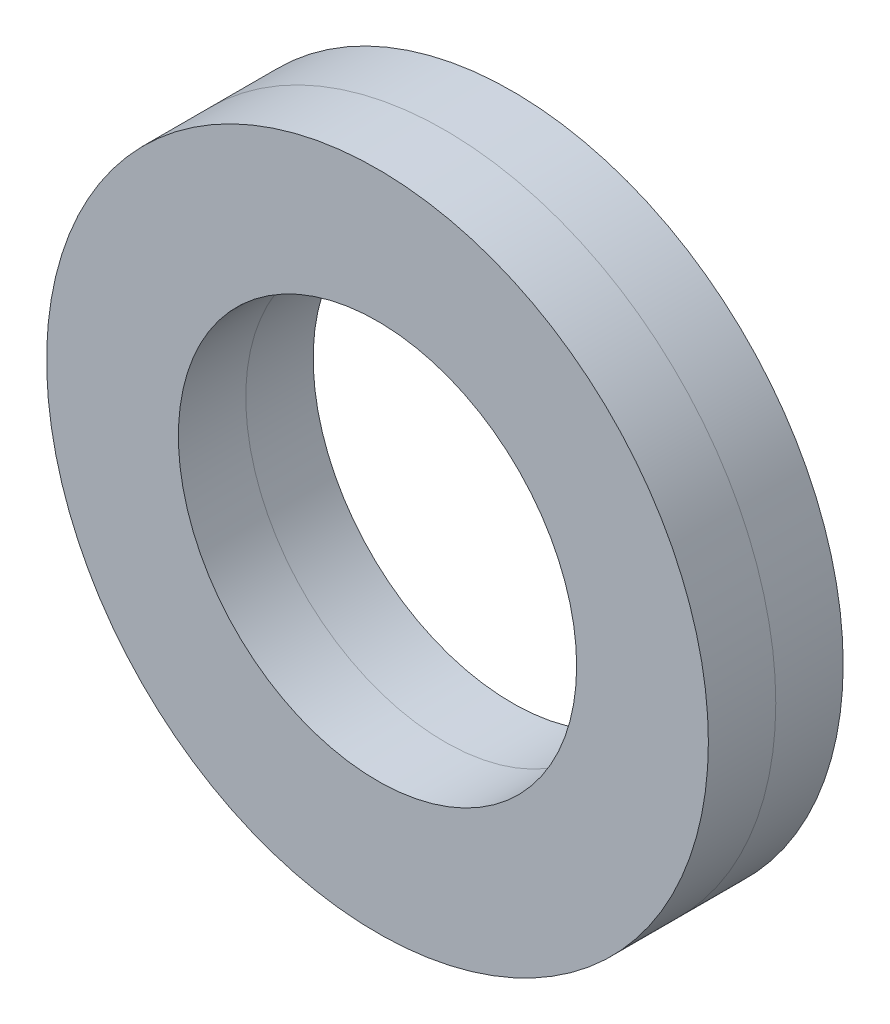
ISO-10303-21;
HEADER;
FILE_DESCRIPTION(('STEP AP214'),'2;1');
FILE_NAME('part.step','',(''),(''),'','','');
FILE_SCHEMA(('AUTOMOTIVE_DESIGN { 1 0 10303 214 1 1 1 1 }'));
ENDSEC;
DATA;
#1=APPLICATION_CONTEXT('core data for automotive mechanical design processes');
#2=APPLICATION_PROTOCOL_DEFINITION('international standard','automotive_design',2000,#1);
#3=PRODUCT_CONTEXT('',#1,'mechanical');
#4=PRODUCT('Part','Part','',(#3));
#5=PRODUCT_RELATED_PRODUCT_CATEGORY('part','',(#4));
#6=PRODUCT_DEFINITION_FORMATION('','',#4);
#7=PRODUCT_DEFINITION_CONTEXT('part definition',#1,'design');
#8=PRODUCT_DEFINITION('design','',#6,#7);
#9=PRODUCT_DEFINITION_SHAPE('','',#8);
#10=(LENGTH_UNIT() NAMED_UNIT(*) SI_UNIT(.MILLI.,.METRE.));
#11=(NAMED_UNIT(*) PLANE_ANGLE_UNIT() SI_UNIT($,.RADIAN.));
#12=(NAMED_UNIT(*) SI_UNIT($,.STERADIAN.) SOLID_ANGLE_UNIT());
#13=UNCERTAINTY_MEASURE_WITH_UNIT(LENGTH_MEASURE(1.E-05),#10,'distance_accuracy_value','');
#14=(GEOMETRIC_REPRESENTATION_CONTEXT(3) GLOBAL_UNCERTAINTY_ASSIGNED_CONTEXT((#13)) GLOBAL_UNIT_ASSIGNED_CONTEXT((#10,
#11,#12)) REPRESENTATION_CONTEXT('',''));
#15=CARTESIAN_POINT('',(0.,0.,0.));
#16=DIRECTION('',(0.,0.,1.));
#17=DIRECTION('',(1.,0.,0.));
#18=AXIS2_PLACEMENT_3D('',#15,#16,#17);
#19=CARTESIAN_POINT('',(0.,0.,0.));
#20=DIRECTION('',(0.,0.,1.));
#21=DIRECTION('',(1.,0.,0.));
#22=AXIS2_PLACEMENT_3D('',#19,#20,#21);
#23=CYLINDRICAL_SURFACE('',#22,3.25);
#24=CARTESIAN_POINT('',(0.,0.,0.));
#25=DIRECTION('',(0.,0.,1.));
#26=DIRECTION('',(1.,0.,0.));
#27=AXIS2_PLACEMENT_3D('',#24,#25,#26);
#28=CIRCLE('',#27,3.25);
#29=CARTESIAN_POINT('',(3.25,0.,0.));
#30=VERTEX_POINT('',#29);
#31=EDGE_CURVE('E72',#30,#30,#28,.T.);
#32=ORIENTED_EDGE('',*,*,#31,.T.);
#33=EDGE_LOOP('',(#32));
#34=FACE_BOUND('',#33,.T.);
#35=CARTESIAN_POINT('',(0.,0.,-1.1000000000001));
#36=DIRECTION('',(0.,0.,1.));
#37=DIRECTION('',(1.,0.,0.));
#38=AXIS2_PLACEMENT_3D('',#35,#36,#37);
#39=CIRCLE('',#38,3.25);
#40=CARTESIAN_POINT('',(3.25,0.,-1.1000000000001));
#41=VERTEX_POINT('',#40);
#42=EDGE_CURVE('E11',#41,#41,#39,.T.);
#43=ORIENTED_EDGE('',*,*,#42,.F.);
#44=EDGE_LOOP('',(#43));
#45=FACE_BOUND('',#44,.T.);
#46=ADVANCED_FACE('F53',(#34,#45),#23,.F.);
#47=CARTESIAN_POINT('',(0.,0.,-1.1000000000001));
#48=DIRECTION('',(0.,0.,-1.));
#49=DIRECTION('',(-1.,0.,0.));
#50=AXIS2_PLACEMENT_3D('',#47,#48,#49);
#51=PLANE('',#50);
#52=ORIENTED_EDGE('',*,*,#42,.T.);
#53=EDGE_LOOP('',(#52));
#54=FACE_BOUND('',#53,.T.);
#55=CARTESIAN_POINT('',(0.,0.,-1.1000000000001));
#56=DIRECTION('',(0.,0.,1.));
#57=DIRECTION('',(1.,0.,0.));
#58=AXIS2_PLACEMENT_3D('',#55,#56,#57);
#59=CIRCLE('',#58,5.4);
#60=CARTESIAN_POINT('',(5.40000000000001,0.,-1.1000000000001));
#61=VERTEX_POINT('',#60);
#62=EDGE_CURVE('E60',#61,#61,#59,.T.);
#63=ORIENTED_EDGE('',*,*,#62,.F.);
#64=EDGE_LOOP('',(#63));
#65=FACE_BOUND('',#64,.T.);
#66=ADVANCED_FACE('F90',(#54,#65),#51,.T.);
#67=CARTESIAN_POINT('',(0.,0.,0.));
#68=DIRECTION('',(0.,0.,1.));
#69=DIRECTION('',(1.,0.,0.));
#70=AXIS2_PLACEMENT_3D('',#67,#68,#69);
#71=CYLINDRICAL_SURFACE('',#70,5.4);
#72=ORIENTED_EDGE('',*,*,#62,.T.);
#73=EDGE_LOOP('',(#72));
#74=FACE_BOUND('',#73,.T.);
#75=CARTESIAN_POINT('',(0.,0.,0.));
#76=DIRECTION('',(0.,0.,1.));
#77=DIRECTION('',(1.,0.,0.));
#78=AXIS2_PLACEMENT_3D('',#75,#76,#77);
#79=CIRCLE('',#78,5.4);
#80=CARTESIAN_POINT('',(5.40000000000001,0.,0.));
#81=VERTEX_POINT('',#80);
#82=EDGE_CURVE('E66',#81,#81,#79,.T.);
#83=ORIENTED_EDGE('',*,*,#82,.F.);
#84=EDGE_LOOP('',(#83));
#85=FACE_BOUND('',#84,.T.);
#86=ADVANCED_FACE('F84',(#74,#85),#71,.T.);
#87=CARTESIAN_POINT('',(0.,0.,0.));
#88=DIRECTION('',(0.,0.,1.));
#89=DIRECTION('',(1.,0.,0.));
#90=AXIS2_PLACEMENT_3D('',#87,#88,#89);
#91=PLANE('',#90);
#92=ORIENTED_EDGE('',*,*,#82,.T.);
#93=EDGE_LOOP('',(#92));
#94=FACE_BOUND('',#93,.T.);
#95=ORIENTED_EDGE('',*,*,#31,.F.);
#96=EDGE_LOOP('',(#95));
#97=FACE_BOUND('',#96,.T.);
#98=ADVANCED_FACE('F82',(#94,#97),#91,.T.);
#99=CLOSED_SHELL('',(#46,#66,#86,#98));
#100=MANIFOLD_SOLID_BREP('B2',#99);
#101=CARTESIAN_POINT('',(0.,0.,0.));
#102=DIRECTION('',(0.,0.,1.));
#103=DIRECTION('',(1.,0.,0.));
#104=AXIS2_PLACEMENT_3D('',#101,#102,#103);
#105=CYLINDRICAL_SURFACE('',#104,5.4);
#106=CARTESIAN_POINT('',(0.,0.,0.));
#107=DIRECTION('',(0.,0.,1.));
#108=DIRECTION('',(1.,0.,0.));
#109=AXIS2_PLACEMENT_3D('',#106,#107,#108);
#110=CIRCLE('',#109,5.4);
#111=CARTESIAN_POINT('',(5.40000000000001,0.,0.));
#112=VERTEX_POINT('',#111);
#113=EDGE_CURVE('E142',#112,#112,#110,.T.);
#114=ORIENTED_EDGE('',*,*,#113,.T.);
#115=EDGE_LOOP('',(#114));
#116=FACE_BOUND('',#115,.T.);
#117=CARTESIAN_POINT('',(0.,0.,1.1000000000001));
#118=DIRECTION('',(0.,0.,1.));
#119=DIRECTION('',(1.,0.,0.));
#120=AXIS2_PLACEMENT_3D('',#117,#118,#119);
#121=CIRCLE('',#120,5.4);
#122=CARTESIAN_POINT('',(5.40000000000001,0.,1.1000000000001));
#123=VERTEX_POINT('',#122);
#124=EDGE_CURVE('E52',#123,#123,#121,.T.);
#125=ORIENTED_EDGE('',*,*,#124,.F.);
#126=EDGE_LOOP('',(#125));
#127=FACE_BOUND('',#126,.T.);
#128=ADVANCED_FACE('F123',(#116,#127),#105,.T.);
#129=CARTESIAN_POINT('',(0.,0.,1.1000000000001));
#130=DIRECTION('',(0.,0.,-1.));
#131=DIRECTION('',(-1.,0.,0.));
#132=AXIS2_PLACEMENT_3D('',#129,#130,#131);
#133=PLANE('',#132);
#134=CARTESIAN_POINT('',(0.,0.,1.1000000000001));
#135=DIRECTION('',(0.,0.,1.));
#136=DIRECTION('',(1.,0.,0.));
#137=AXIS2_PLACEMENT_3D('',#134,#135,#136);
#138=CIRCLE('',#137,3.25);
#139=CARTESIAN_POINT('',(3.25,0.,1.1000000000001));
#140=VERTEX_POINT('',#139);
#141=EDGE_CURVE('E130',#140,#140,#138,.T.);
#142=ORIENTED_EDGE('',*,*,#141,.F.);
#143=EDGE_LOOP('',(#142));
#144=FACE_BOUND('',#143,.T.);
#145=ORIENTED_EDGE('',*,*,#124,.T.);
#146=EDGE_LOOP('',(#145));
#147=FACE_BOUND('',#146,.T.);
#148=ADVANCED_FACE('F160',(#144,#147),#133,.F.);
#149=CARTESIAN_POINT('',(0.,0.,0.));
#150=DIRECTION('',(0.,0.,1.));
#151=DIRECTION('',(1.,0.,0.));
#152=AXIS2_PLACEMENT_3D('',#149,#150,#151);
#153=CYLINDRICAL_SURFACE('',#152,3.25);
#154=ORIENTED_EDGE('',*,*,#141,.T.);
#155=EDGE_LOOP('',(#154));
#156=FACE_BOUND('',#155,.T.);
#157=CARTESIAN_POINT('',(0.,0.,0.));
#158=DIRECTION('',(0.,0.,1.));
#159=DIRECTION('',(1.,0.,0.));
#160=AXIS2_PLACEMENT_3D('',#157,#158,#159);
#161=CIRCLE('',#160,3.25);
#162=CARTESIAN_POINT('',(3.25,0.,0.));
#163=VERTEX_POINT('',#162);
#164=EDGE_CURVE('E136',#163,#163,#161,.T.);
#165=ORIENTED_EDGE('',*,*,#164,.F.);
#166=EDGE_LOOP('',(#165));
#167=FACE_BOUND('',#166,.T.);
#168=ADVANCED_FACE('F155',(#156,#167),#153,.F.);
#169=CARTESIAN_POINT('',(0.,0.,0.));
#170=DIRECTION('',(0.,0.,1.));
#171=DIRECTION('',(1.,0.,0.));
#172=AXIS2_PLACEMENT_3D('',#169,#170,#171);
#173=PLANE('',#172);
#174=ORIENTED_EDGE('',*,*,#113,.F.);
#175=EDGE_LOOP('',(#174));
#176=FACE_BOUND('',#175,.T.);
#177=ORIENTED_EDGE('',*,*,#164,.T.);
#178=EDGE_LOOP('',(#177));
#179=FACE_BOUND('',#178,.T.);
#180=ADVANCED_FACE('F152',(#176,#179),#173,.F.);
#181=CLOSED_SHELL('',(#128,#148,#168,#180));
#182=MANIFOLD_SOLID_BREP('B6',#181);
#183=ADVANCED_BREP_SHAPE_REPRESENTATION('',(#18,#100,#182),#14);
#184=SHAPE_DEFINITION_REPRESENTATION(#9,#183);
ENDSEC;
END-ISO-10303-21;
